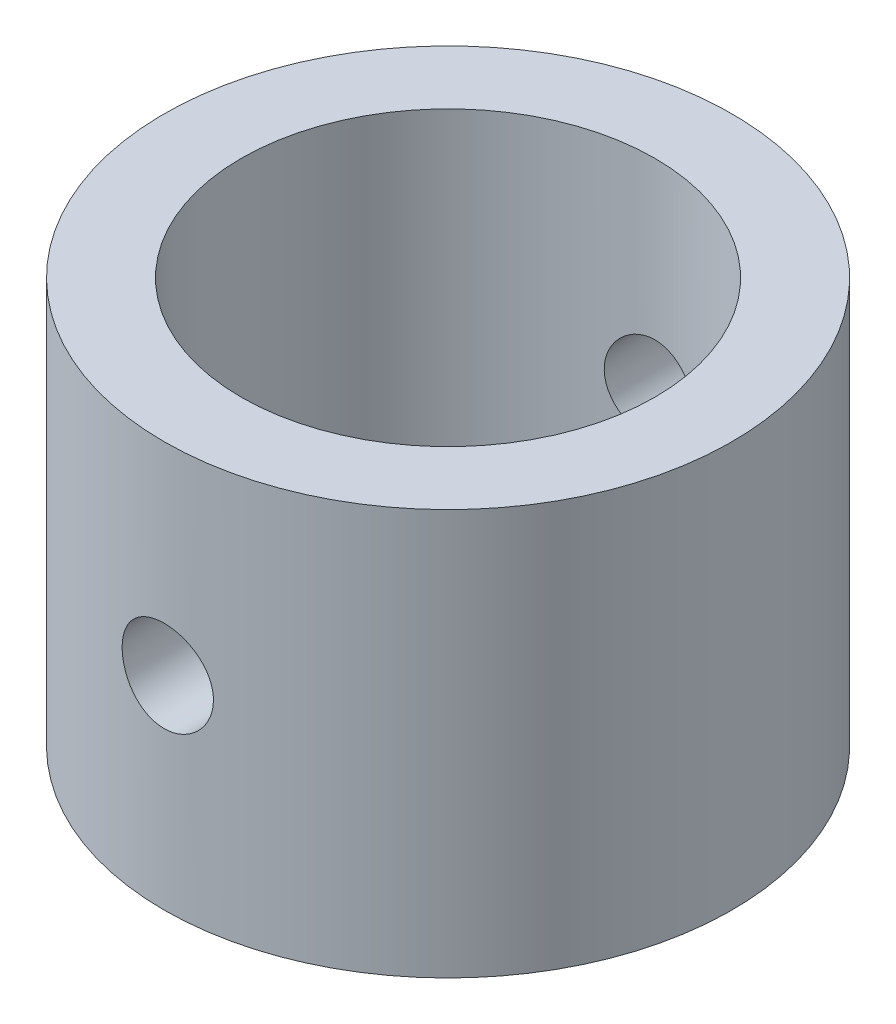
ISO-10303-21;
HEADER;
FILE_DESCRIPTION(('STEP AP214'),'2;1');
FILE_NAME('part.step','',(''),(''),'','','');
FILE_SCHEMA(('AUTOMOTIVE_DESIGN { 1 0 10303 214 1 1 1 1 }'));
ENDSEC;
DATA;
#1=APPLICATION_CONTEXT('core data for automotive mechanical design processes');
#2=APPLICATION_PROTOCOL_DEFINITION('international standard','automotive_design',2000,#1);
#3=PRODUCT_CONTEXT('',#1,'mechanical');
#4=PRODUCT('Part','Part','',(#3));
#5=PRODUCT_RELATED_PRODUCT_CATEGORY('part','',(#4));
#6=PRODUCT_DEFINITION_FORMATION('','',#4);
#7=PRODUCT_DEFINITION_CONTEXT('part definition',#1,'design');
#8=PRODUCT_DEFINITION('design','',#6,#7);
#9=PRODUCT_DEFINITION_SHAPE('','',#8);
#10=(LENGTH_UNIT() NAMED_UNIT(*) SI_UNIT(.MILLI.,.METRE.));
#11=(NAMED_UNIT(*) PLANE_ANGLE_UNIT() SI_UNIT($,.RADIAN.));
#12=(NAMED_UNIT(*) SI_UNIT($,.STERADIAN.) SOLID_ANGLE_UNIT());
#13=UNCERTAINTY_MEASURE_WITH_UNIT(LENGTH_MEASURE(1.E-05),#10,'distance_accuracy_value','');
#14=(GEOMETRIC_REPRESENTATION_CONTEXT(3) GLOBAL_UNCERTAINTY_ASSIGNED_CONTEXT((#13)) GLOBAL_UNIT_ASSIGNED_CONTEXT((#10,
#11,#12)) REPRESENTATION_CONTEXT('',''));
#15=CARTESIAN_POINT('',(0.,0.,0.));
#16=DIRECTION('',(0.,0.,1.));
#17=DIRECTION('',(1.,0.,0.));
#18=AXIS2_PLACEMENT_3D('',#15,#16,#17);
#19=CARTESIAN_POINT('',(0.,10.,0.));
#20=DIRECTION('',(0.,1.,0.));
#21=DIRECTION('',(0.,0.,1.));
#22=AXIS2_PLACEMENT_3D('',#19,#20,#21);
#23=PLANE('',#22);
#24=CARTESIAN_POINT('',(0.,10.,0.));
#25=DIRECTION('',(0.,1.,0.));
#26=DIRECTION('',(0.,0.,1.));
#27=AXIS2_PLACEMENT_3D('',#24,#25,#26);
#28=CIRCLE('',#27,14.);
#29=CARTESIAN_POINT('',(0.,10.,14.));
#30=VERTEX_POINT('',#29);
#31=EDGE_CURVE('E10',#30,#30,#28,.T.);
#32=ORIENTED_EDGE('',*,*,#31,.T.);
#33=EDGE_LOOP('',(#32));
#34=FACE_BOUND('',#33,.T.);
#35=CARTESIAN_POINT('',(0.,10.,0.));
#36=DIRECTION('',(0.,1.,0.));
#37=DIRECTION('',(0.,0.,1.));
#38=AXIS2_PLACEMENT_3D('',#35,#36,#37);
#39=CIRCLE('',#38,10.2);
#40=CARTESIAN_POINT('',(0.,10.,10.2));
#41=VERTEX_POINT('',#40);
#42=EDGE_CURVE('E58',#41,#41,#39,.T.);
#43=ORIENTED_EDGE('',*,*,#42,.F.);
#44=EDGE_LOOP('',(#43));
#45=FACE_BOUND('',#44,.T.);
#46=ADVANCED_FACE('F37',(#34,#45),#23,.T.);
#47=CARTESIAN_POINT('',(0.,-10.,0.));
#48=DIRECTION('',(0.,1.,0.));
#49=DIRECTION('',(0.,0.,1.));
#50=AXIS2_PLACEMENT_3D('',#47,#48,#49);
#51=PLANE('',#50);
#52=CARTESIAN_POINT('',(0.,-10.,0.));
#53=DIRECTION('',(0.,1.,0.));
#54=DIRECTION('',(0.,0.,1.));
#55=AXIS2_PLACEMENT_3D('',#52,#53,#54);
#56=CIRCLE('',#55,14.);
#57=CARTESIAN_POINT('',(0.,-10.,14.));
#58=VERTEX_POINT('',#57);
#59=EDGE_CURVE('E52',#58,#58,#56,.T.);
#60=ORIENTED_EDGE('',*,*,#59,.F.);
#61=EDGE_LOOP('',(#60));
#62=FACE_BOUND('',#61,.T.);
#63=CARTESIAN_POINT('',(0.,-10.,0.));
#64=DIRECTION('',(0.,1.,0.));
#65=DIRECTION('',(0.,0.,1.));
#66=AXIS2_PLACEMENT_3D('',#63,#64,#65);
#67=CIRCLE('',#66,10.2);
#68=CARTESIAN_POINT('',(0.,-10.,10.2));
#69=VERTEX_POINT('',#68);
#70=EDGE_CURVE('E61',#69,#69,#67,.T.);
#71=ORIENTED_EDGE('',*,*,#70,.T.);
#72=EDGE_LOOP('',(#71));
#73=FACE_BOUND('',#72,.T.);
#74=ADVANCED_FACE('F102',(#62,#73),#51,.F.);
#75=CARTESIAN_POINT('',(0.,10.,0.));
#76=DIRECTION('',(0.,-1.,0.));
#77=DIRECTION('',(0.,0.,-1.));
#78=AXIS2_PLACEMENT_3D('',#75,#76,#77);
#79=CYLINDRICAL_SURFACE('',#78,14.);
#80=CARTESIAN_POINT('',(0.,2.25,-14.));
#81=CARTESIAN_POINT('',(-0.125516533296971,2.24999491192685,-13.9999978953155));
#82=CARTESIAN_POINT('',(-0.251103168327577,2.23946159453523,-13.9982944063614));
#83=CARTESIAN_POINT('',(-0.498758541647425,2.19762162062177,-13.9916628549738));
#84=CARTESIAN_POINT('',(-0.620823862200513,2.1662954467732,-13.9867317629939));
#85=CARTESIAN_POINT('',(-0.857817334758492,2.08383634265778,-13.9741984828469));
#86=CARTESIAN_POINT('',(-0.972751077913987,2.03271916211685,-13.9665984190993));
#87=CARTESIAN_POINT('',(-1.19239438325836,1.9121693193533,-13.9495643746679));
#88=CARTESIAN_POINT('',(-1.2971052045874,1.84273891664883,-13.9401306202659));
#89=CARTESIAN_POINT('',(-1.49427970681561,1.68687455477166,-13.9203821378141));
#90=CARTESIAN_POINT('',(-1.5866390108593,1.60030935524402,-13.9100609815654));
#91=CARTESIAN_POINT('',(-1.75558751079347,1.41291514321349,-13.8897505626212));
#92=CARTESIAN_POINT('',(-1.83217574468168,1.31208526122732,-13.879761320203));
#93=CARTESIAN_POINT('',(-1.96782198120126,1.0983125852725,-13.8611834660328));
#94=CARTESIAN_POINT('',(-2.02677758177242,0.985304028797502,-13.8526031617175));
#95=CARTESIAN_POINT('',(-2.12483033718463,0.750827212664779,-13.8379033650299));
#96=CARTESIAN_POINT('',(-2.1639287371439,0.629359483970944,-13.8317837183705));
#97=CARTESIAN_POINT('',(-2.22083007809586,0.382515668063071,-13.8227618401327));
#98=CARTESIAN_POINT('',(-2.2388126801822,0.257182005550972,-13.8198324801479));
#99=CARTESIAN_POINT('',(-2.25352883443453,0.0052445866959005,-13.8174406805388));
#100=CARTESIAN_POINT('',(-2.25026378530402,-0.121359085496286,-13.817978012707));
#101=CARTESIAN_POINT('',(-2.22272383675772,-0.370965144860001,-13.8224341022552));
#102=CARTESIAN_POINT('',(-2.19865012172645,-0.49399039133296,-13.8263204789813));
#103=CARTESIAN_POINT('',(-2.13049164056933,-0.734232553432275,-13.8369861134628));
#104=CARTESIAN_POINT('',(-2.08640623221295,-0.851449282513342,-13.8437654640614));
#105=CARTESIAN_POINT('',(-1.97926987660231,-1.07735296235875,-13.8594884549807));
#106=CARTESIAN_POINT('',(-1.91613477101002,-1.18599930712865,-13.8684416640377));
#107=CARTESIAN_POINT('',(-1.7727510132204,-1.39123208940431,-13.8874968298953));
#108=CARTESIAN_POINT('',(-1.69250107470795,-1.48781761957885,-13.8975988730133));
#109=CARTESIAN_POINT('',(-1.51606648187991,-1.66735215012952,-13.9179560350544));
#110=CARTESIAN_POINT('',(-1.41970908051139,-1.75013143216778,-13.9282115777295));
#111=CARTESIAN_POINT('',(-1.2143806998317,-1.89837114136773,-13.9476125542075));
#112=CARTESIAN_POINT('',(-1.10540964947444,-1.96383147097402,-13.9567579817571));
#113=CARTESIAN_POINT('',(-0.877792282352266,-2.07558805464745,-13.9729199627032));
#114=CARTESIAN_POINT('',(-0.75913882854674,-2.12187001650982,-13.9799349273889));
#115=CARTESIAN_POINT('',(-0.51560535892936,-2.19380226680228,-13.991032650818));
#116=CARTESIAN_POINT('',(-0.390725827843726,-2.21945415871432,-13.9951156374482));
#117=CARTESIAN_POINT('',(-0.139748614277979,-2.24916965405059,-13.9998588902675));
#118=CARTESIAN_POINT('',(-0.01367920571617,-2.25346637021372,-14.0005561134573));
#119=CARTESIAN_POINT('',(0.237378752507188,-2.24097002524617,-13.9985502742979));
#120=CARTESIAN_POINT('',(0.362367340584751,-2.22417771681883,-13.9958473333064));
#121=CARTESIAN_POINT('',(0.607000788097725,-2.17017387383038,-13.9873677389695));
#122=CARTESIAN_POINT('',(0.726671625613749,-2.13307707167091,-13.9816083618081));
#123=CARTESIAN_POINT('',(0.958095333397108,-2.03963910536011,-13.9676592546813));
#124=CARTESIAN_POINT('',(1.06984778490242,-1.98329692433714,-13.9594693962991));
#125=CARTESIAN_POINT('',(1.28327965745295,-1.85242886164486,-13.9414766855724));
#126=CARTESIAN_POINT('',(1.38486818456638,-1.77775653102941,-13.9316610604782));
#127=CARTESIAN_POINT('',(1.57415535691987,-1.61255019273464,-13.9115460049717));
#128=CARTESIAN_POINT('',(1.66185306743064,-1.52201511849538,-13.9012465420618));
#129=CARTESIAN_POINT('',(1.82172745317086,-1.32661054590671,-13.8812059717835));
#130=CARTESIAN_POINT('',(1.8937470747044,-1.22161180310217,-13.871471172488));
#131=CARTESIAN_POINT('',(2.01912597155802,-1.00086981075429,-13.8537776909451));
#132=CARTESIAN_POINT('',(2.07248580747758,-0.885126884132718,-13.8458189553416));
#133=CARTESIAN_POINT('',(2.15879239469767,-0.646631920879235,-13.8326254500163));
#134=CARTESIAN_POINT('',(2.19181896632761,-0.52390938451031,-13.8273800419845));
#135=CARTESIAN_POINT('',(2.23677380807863,-0.274567940734186,-13.8201798155706));
#136=CARTESIAN_POINT('',(2.24870377188689,-0.147949346942423,-13.8182247330338));
#137=CARTESIAN_POINT('',(2.25108206443364,0.10402279363205,-13.8178373502801));
#138=CARTESIAN_POINT('',(2.24177749627082,0.229374014843842,-13.8193645273463));
#139=CARTESIAN_POINT('',(2.20248339939032,0.476703241059103,-13.8256810526982));
#140=CARTESIAN_POINT('',(2.17249392454782,0.598681254847449,-13.8304703924874));
#141=CARTESIAN_POINT('',(2.09277331754399,0.83571595850409,-13.8427566578776));
#142=CARTESIAN_POINT('',(2.04306199075129,0.950779459089346,-13.8502508664761));
#143=CARTESIAN_POINT('',(1.92533386106839,1.17097320402977,-13.8671053274846));
#144=CARTESIAN_POINT('',(1.85731625543178,1.2761030125106,-13.8764656617212));
#145=CARTESIAN_POINT('',(1.70401854872738,1.47469620036646,-13.8961268489787));
#146=CARTESIAN_POINT('',(1.61855618855353,1.56801799448917,-13.9064369431357));
#147=CARTESIAN_POINT('',(1.43317978986591,1.73908156829962,-13.9267609958316));
#148=CARTESIAN_POINT('',(1.33326241319938,1.81681973928121,-13.9367748853215));
#149=CARTESIAN_POINT('',(1.12105724158449,1.95495911574053,-13.9554519057441));
#150=CARTESIAN_POINT('',(1.00869460504507,2.01524657121163,-13.9641060131734));
#151=CARTESIAN_POINT('',(0.775346742328359,2.11599979291454,-13.9790004101793));
#152=CARTESIAN_POINT('',(0.654370373204388,2.15648559238242,-13.9852431379863));
#153=CARTESIAN_POINT('',(0.444080359846441,2.20755159889226,-13.9932258515082));
#154=CARTESIAN_POINT('',(0.356048797339001,2.22344469007745,-13.9957527763908));
#155=CARTESIAN_POINT('',(0.178689987837779,2.24467062083802,-13.9991405870761));
#156=CARTESIAN_POINT('',(0.0893627607529358,2.25000362250495,-14.0000014984513));
#157=CARTESIAN_POINT('',(0.,2.25,-14.));
#158=B_SPLINE_CURVE_WITH_KNOTS('',3,(#80,#81,#82,#83,#84,#85,#86,#87,#88,#89,#90,#91,#92,#93,
#94,#95,#96,#97,#98,#99,#100,#101,#102,#103,#104,#105,#106,#107,#108,#109,#110,#111,#112,#113,
#114,#115,#116,#117,#118,#119,#120,#121,#122,#123,#124,#125,#126,#127,#128,#129,#130,#131,#132,
#133,#134,#135,#136,#137,#138,#139,#140,#141,#142,#143,#144,#145,#146,#147,#148,#149,#150,#151,
#152,#153,#154,#155,#156,#157),.UNSPECIFIED.,.T.,.F.,(4,2,2,2,2,2,2,2,2,2,2,2,2,2,2,2,2,2,2,2,2,
2,2,2,2,2,2,2,2,2,2,2,2,2,2,2,2,2,4),(0.,0.3762229925383,0.752799629164132,1.12907719922893,
1.505308365192,1.88454122461197,2.26379720959484,2.64521477626392,3.02660842372012,
3.40473296198993,3.78283260909597,4.15731705278776,4.5318135155697,4.9079892861148,
5.28419333921513,5.66472669966152,6.04526220355716,6.42608078433829,6.80686976295353,
7.18349278385415,7.56010236281749,7.93460552093183,8.30912846980019,8.68674705506086,
9.06439103993249,9.44565973837655,9.82691698130851,10.2066678539783,10.5863882379366,
10.9617124352364,11.3370356549837,11.7119829123441,12.0869466141509,12.4660492312635,
12.8452395361732,13.2268485762512,13.6080707416578,13.8759306040537,14.1437863549165),.UNSPECIFIED.);
#159=CARTESIAN_POINT('',(0.,2.25,-14.));
#160=VERTEX_POINT('',#159);
#161=EDGE_CURVE('E88',#160,#160,#158,.T.);
#162=ORIENTED_EDGE('',*,*,#161,.T.);
#163=EDGE_LOOP('',(#162));
#164=FACE_BOUND('',#163,.T.);
#165=CARTESIAN_POINT('',(2.25,0.,13.8180136054355));
#166=CARTESIAN_POINT('',(2.2499949019903,-0.125504732771006,13.8180158143356));
#167=CARTESIAN_POINT('',(2.23946349824246,-0.251079597561315,13.8197420063408));
#168=CARTESIAN_POINT('',(2.19763181494983,-0.498710522553538,13.8264545702036));
#169=CARTESIAN_POINT('',(2.1663119749452,-0.620763155611108,13.8314440124859));
#170=CARTESIAN_POINT('',(2.08387139310641,-0.857729778170382,13.8441037030698));
#171=CARTESIAN_POINT('',(2.03276670010773,-0.972649466242985,13.8517717780596));
#172=CARTESIAN_POINT('',(1.91224628050508,-1.19226914240462,13.8689221632735));
#173=CARTESIAN_POINT('',(1.84283278367579,-1.29697037284334,13.8784042525357));
#174=CARTESIAN_POINT('',(1.68698563634041,-1.49415537839284,13.8982114889076));
#175=CARTESIAN_POINT('',(1.60041695690168,-1.58653181527783,13.9085429171883));
#176=CARTESIAN_POINT('',(1.41300854829686,-1.75551347537041,13.9288288469069));
#177=CARTESIAN_POINT('',(1.3121679968303,-1.83211778921304,13.9387833265841));
#178=CARTESIAN_POINT('',(1.09838564892168,-1.96778110258191,13.9572599640666));
#179=CARTESIAN_POINT('',(0.985379925683778,-2.02674058201544,13.9657738839782));
#180=CARTESIAN_POINT('',(0.750909255437473,-2.12480128575263,13.9803403340124));
#181=CARTESIAN_POINT('',(0.629444820813649,-2.16390371170516,13.9863930130725));
#182=CARTESIAN_POINT('',(0.382612416075231,-2.22081308024024,13.9953106771013));
#183=CARTESIAN_POINT('',(0.257286968989389,-2.23880016566319,13.9982026126886));
#184=CARTESIAN_POINT('',(0.0053657339776195,-2.25352813465873,14.0005654594673));
#185=CARTESIAN_POINT('',(-0.121229972889171,-2.25027036542877,14.000036587582));
#186=CARTESIAN_POINT('',(-0.37086743101994,-2.22274220536869,13.9956388165465));
#187=CARTESIAN_POINT('',(-0.493931178306543,-2.19866565952152,13.9918007306488));
#188=CARTESIAN_POINT('',(-0.734248869659234,-2.13048827281503,13.9812501178409));
#189=CARTESIAN_POINT('',(-0.851502646539959,-2.08638685609882,13.9745375082682));
#190=CARTESIAN_POINT('',(-1.07745224991504,-1.97921682625188,13.9589394210759));
#191=CARTESIAN_POINT('',(-1.18610922857626,-1.91606770160813,13.9500447506393));
#192=CARTESIAN_POINT('',(-1.39135738695854,-1.77265373625922,13.9310719029915));
#193=CARTESIAN_POINT('',(-1.4879476562894,-1.69238760537217,13.9209936365935));
#194=CARTESIAN_POINT('',(-1.66746488622605,-1.51594118870135,13.9006413457914));
#195=CARTESIAN_POINT('',(-1.75022536650925,-1.419591543466,13.8903663957158));
#196=CARTESIAN_POINT('',(-1.89843078838734,-1.21428549681817,13.8708891283976));
#197=CARTESIAN_POINT('',(-1.96387559119058,-1.10532899436706,13.861686819753));
#198=CARTESIAN_POINT('',(-2.07562085663178,-0.877716254800834,13.8453965432241));
#199=CARTESIAN_POINT('',(-2.12190235831856,-0.759050549336767,13.8383106713505));
#200=CARTESIAN_POINT('',(-2.19382996628623,-0.515490349518272,13.8270910884814));
#201=CARTESIAN_POINT('',(-2.21947775464433,-0.390596363780057,13.822957136846));
#202=CARTESIAN_POINT('',(-2.24917771973425,-0.139611357135541,13.8181556881829));
#203=CARTESIAN_POINT('',(-2.25346672746734,-0.0135490643513698,13.8174501779496));
#204=CARTESIAN_POINT('',(-2.24095750557602,0.23749283743298,13.8194843635913));
#205=CARTESIAN_POINT('',(-2.22416003099588,0.362472485038121,13.8222239361082));
#206=CARTESIAN_POINT('',(-2.17015619952393,0.607055945852306,13.8308045601376));
#207=CARTESIAN_POINT('',(-2.13306944727635,0.726686861750487,13.8366274293191));
#208=CARTESIAN_POINT('',(-2.03966487822762,0.958035147666284,13.850703396658));
#209=CARTESIAN_POINT('',(-1.98334598412219,1.06975207395187,13.8589566309507));
#210=CARTESIAN_POINT('',(-1.85251316029193,1.2831579914825,13.8770521782456));
#211=CARTESIAN_POINT('',(-1.7778468945306,1.38475246320142,13.886907548938));
#212=CARTESIAN_POINT('',(-1.61264890126915,1.57405443467415,13.9070583117423));
#213=CARTESIAN_POINT('',(-1.52211613899784,1.66176102798646,13.9173537325201));
#214=CARTESIAN_POINT('',(-1.32670807927494,1.82165712109073,13.9373442751628));
#215=CARTESIAN_POINT('',(-1.22170304760801,1.8936890421619,13.9470326606656));
#216=CARTESIAN_POINT('',(-1.00094495604244,2.01908949130633,13.9646107137023));
#217=CARTESIAN_POINT('',(-0.885192224745501,2.07245858974172,13.9725004362034));
#218=CARTESIAN_POINT('',(-0.64670142804812,2.1587707969855,13.9855628405076));
#219=CARTESIAN_POINT('',(-0.523994333659257,2.19179772513674,13.9907466582525));
#220=CARTESIAN_POINT('',(-0.274685660668645,2.23675850314725,13.9978601357504));
#221=CARTESIAN_POINT('',(-0.148084379853011,2.24869396179906,13.9997900437012));
#222=CARTESIAN_POINT('',(0.103895289129518,2.25108929111569,14.0001751220149));
#223=CARTESIAN_POINT('',(0.229271399482689,2.24178941298781,13.9986691650403));
#224=CARTESIAN_POINT('',(0.47665162878274,2.20249598268264,13.9924307182936));
#225=CARTESIAN_POINT('',(0.598655763466231,2.17250252709682,13.9876982435818));
#226=CARTESIAN_POINT('',(0.835746505612654,2.09276301465596,13.9755363711605));
#227=CARTESIAN_POINT('',(0.950839657845103,2.04303599650222,13.9681095734919));
#228=CARTESIAN_POINT('',(1.17108623058329,1.92526723336825,13.9513716274726));
#229=CARTESIAN_POINT('',(1.27623923359936,1.85722471959233,13.9420604000267));
#230=CARTESIAN_POINT('',(1.47483400791959,1.70389838988066,13.9224618007875));
#231=CARTESIAN_POINT('',(1.56813860795188,1.61843808333874,13.9121650601924));
#232=CARTESIAN_POINT('',(1.73916844442504,1.43307302781877,13.8918224249021));
#233=CARTESIAN_POINT('',(1.81689002569547,1.33316489938053,13.8817765895422));
#234=CARTESIAN_POINT('',(1.95501006976206,1.12096843045257,13.8630025603077));
#235=CARTESIAN_POINT('',(2.01529216853239,1.00860354966341,13.8542833934605));
#236=CARTESIAN_POINT('',(2.11603476746344,0.775251208551566,13.8392562448519));
#237=CARTESIAN_POINT('',(2.15651535402701,0.654272629200527,13.8329458211258));
#238=CARTESIAN_POINT('',(2.20756776728415,0.44399629895971,13.8248718092132));
#239=CARTESIAN_POINT('',(2.22345476618064,0.355981561552269,13.8223140356461));
#240=CARTESIAN_POINT('',(2.24467261207563,0.178656382936134,13.8188841610933));
#241=CARTESIAN_POINT('',(2.25000362923831,0.0893459626374435,13.8180120329346));
#242=CARTESIAN_POINT('',(2.25,0.,13.8180136054355));
#243=B_SPLINE_CURVE_WITH_KNOTS('',3,(#165,#166,#167,#168,#169,#170,#171,#172,#173,#174,#175,
#176,#177,#178,#179,#180,#181,#182,#183,#184,#185,#186,#187,#188,#189,#190,#191,#192,#193,#194,
#195,#196,#197,#198,#199,#200,#201,#202,#203,#204,#205,#206,#207,#208,#209,#210,#211,#212,#213,
#214,#215,#216,#217,#218,#219,#220,#221,#222,#223,#224,#225,#226,#227,#228,#229,#230,#231,#232,
#233,#234,#235,#236,#237,#238,#239,#240,#241,#242),.UNSPECIFIED.,.T.,.F.,(4,2,2,2,2,2,2,2,2,2,2,
2,2,2,2,2,2,2,2,2,2,2,2,2,2,2,2,2,2,2,2,2,2,2,2,2,2,2,4),(0.,0.376187533649366,
0.752729536107984,1.12896673764322,1.50515813950989,1.8844374148329,2.26373855194078,
2.64514035629039,3.0265190773722,3.40461990725563,3.78269676090913,4.15729076600476,
4.53189554401378,4.90810644725458,5.28434571714748,5.66483058584771,6.04531850418464,
6.42618199831163,6.80701444098739,7.18361457608907,7.5602012266437,7.93459146442295,
8.30900267742112,8.68663435013169,9.06429066015825,9.44558414005216,9.82686596606156,
10.2065660327795,10.5862371358917,10.9616340490979,11.3370292100753,11.712063071469,
12.087112677421,12.4661705354271,12.8453172019205,13.2269382476957,13.6081713749863,
13.8759810297257,14.1437863672936),.UNSPECIFIED.);
#244=CARTESIAN_POINT('',(2.25,0.,13.8180136054355));
#245=VERTEX_POINT('',#244);
#246=EDGE_CURVE('E82',#245,#245,#243,.T.);
#247=ORIENTED_EDGE('',*,*,#246,.T.);
#248=EDGE_LOOP('',(#247));
#249=FACE_BOUND('',#248,.T.);
#250=ORIENTED_EDGE('',*,*,#31,.F.);
#251=EDGE_LOOP('',(#250));
#252=FACE_BOUND('',#251,.T.);
#253=ORIENTED_EDGE('',*,*,#59,.T.);
#254=EDGE_LOOP('',(#253));
#255=FACE_BOUND('',#254,.T.);
#256=ADVANCED_FACE('F39',(#164,#249,#252,#255),#79,.T.);
#257=CARTESIAN_POINT('',(0.,10.,0.));
#258=DIRECTION('',(0.,-1.,0.));
#259=DIRECTION('',(0.,0.,-1.));
#260=AXIS2_PLACEMENT_3D('',#257,#258,#259);
#261=CYLINDRICAL_SURFACE('',#260,10.2);
#262=CARTESIAN_POINT('',(0.,2.25,-10.2));
#263=CARTESIAN_POINT('',(-0.124764174505006,2.24999577656357,-10.1999977027666));
#264=CARTESIAN_POINT('',(-0.249579153208695,2.23958757126949,-10.1976876313943));
#265=CARTESIAN_POINT('',(-0.495661985850825,2.19827403882562,-10.1886954635131));
#266=CARTESIAN_POINT('',(-0.616927271339807,2.16735423507471,-10.1820102791978));
#267=CARTESIAN_POINT('',(-0.852318898678437,2.086034497785,-10.1650120015536));
#268=CARTESIAN_POINT('',(-0.966452614575012,2.03565508611887,-10.1547027311693));
#269=CARTESIAN_POINT('',(-1.18464370312069,1.91691175478381,-10.1315681097671));
#270=CARTESIAN_POINT('',(-1.28870130187285,1.8485482387972,-10.1187428152272));
#271=CARTESIAN_POINT('',(-1.48548669232062,1.6945978533885,-10.091746625768));
#272=CARTESIAN_POINT('',(-1.57802668841411,1.60877388398141,-10.0775588054433));
#273=CARTESIAN_POINT('',(-1.74752142602877,1.4228477511948,-10.0495554871774));
#274=CARTESIAN_POINT('',(-1.82447475890951,1.32274429870294,-10.0357400229855));
#275=CARTESIAN_POINT('',(-1.96144336336071,1.10970835306626,-10.0098785747494));
#276=CARTESIAN_POINT('',(-2.0212581443349,0.996644090401658,-9.99785426794003));
#277=CARTESIAN_POINT('',(-2.12096549481324,0.761759539182453,-9.97717973314191));
#278=CARTESIAN_POINT('',(-2.16086049019061,0.639940318892932,-9.96852909432888));
#279=CARTESIAN_POINT('',(-2.21897402474801,0.39304260430619,-9.9557538178659));
#280=CARTESIAN_POINT('',(-2.23752535760456,0.268046109803409,-9.95155977373163));
#281=CARTESIAN_POINT('',(-2.25345984807385,0.0166500148252579,-9.94796413881408));
#282=CARTESIAN_POINT('',(-2.25084565369365,-0.109749408154606,-9.9485619485246));
#283=CARTESIAN_POINT('',(-2.22479098131645,-0.357885076634104,-9.95441966531722));
#284=CARTESIAN_POINT('',(-2.20173765027849,-0.47966432981722,-9.9595929027298));
#285=CARTESIAN_POINT('',(-2.13607269880298,-0.717583086430618,-9.97388149095551));
#286=CARTESIAN_POINT('',(-2.09345996425897,-0.833722268184858,-9.98299706632309));
#287=CARTESIAN_POINT('',(-1.98953179202404,-1.05814964595546,-10.0042283104756));
#288=CARTESIAN_POINT('',(-1.9280679633098,-1.16636679388057,-10.0163676336361));
#289=CARTESIAN_POINT('',(-1.78828664178137,-1.3710942305395,-10.0422641355573));
#290=CARTESIAN_POINT('',(-1.70996681445608,-1.46760289478136,-10.056021538298));
#291=CARTESIAN_POINT('',(-1.53664981310273,-1.64840220719729,-10.0839755658964));
#292=CARTESIAN_POINT('',(-1.44132356993324,-1.73237725634981,-10.0981751941245));
#293=CARTESIAN_POINT('',(-1.23777995455844,-1.88320074793411,-10.1251381918741));
#294=CARTESIAN_POINT('',(-1.12956234108643,-1.95004886975543,-10.1379015345065));
#295=CARTESIAN_POINT('',(-0.902919035635492,-2.06480100498394,-10.1605964257697));
#296=CARTESIAN_POINT('',(-0.784471456765543,-2.11266311092598,-10.1705216966576));
#297=CARTESIAN_POINT('',(-0.540947212530485,-2.18771656449219,-10.1863755462739));
#298=CARTESIAN_POINT('',(-0.415871530929465,-2.21491097054111,-10.1923047163342));
#299=CARTESIAN_POINT('',(-0.165348136015659,-2.24739675854658,-10.1994139510997));
#300=CARTESIAN_POINT('',(-0.0399588926663982,-2.25311917460944,-10.2006874610742));
#301=CARTESIAN_POINT('',(0.209983939541013,-2.24366762083829,-10.1986039845559));
#302=CARTESIAN_POINT('',(0.334537585501884,-2.22849509383726,-10.1952473177851));
#303=CARTESIAN_POINT('',(0.57784154466608,-2.17804166285798,-10.1843396728686));
#304=CARTESIAN_POINT('',(0.696641153218765,-2.14298734743218,-10.17683598172));
#305=CARTESIAN_POINT('',(0.926673931622172,-2.05401731493757,-10.1584743955523));
#306=CARTESIAN_POINT('',(1.03790644833292,-2.00009997220127,-10.1476162114432));
#307=CARTESIAN_POINT('',(1.25142613768722,-1.87403986835163,-10.1235198955913));
#308=CARTESIAN_POINT('',(1.35356048954898,-1.80164454909581,-10.1102495839341));
#309=CARTESIAN_POINT('',(1.54438559075579,-1.64101554401239,-10.0828657904622));
#310=CARTESIAN_POINT('',(1.63307455930169,-1.55277976353948,-10.0687521973021));
#311=CARTESIAN_POINT('',(1.79619959237253,-1.3609951347569,-10.0409489876431));
#312=CARTESIAN_POINT('',(1.87033694324694,-1.25718998746651,-10.0272722983527));
#313=CARTESIAN_POINT('',(2.00012805974088,-1.03834930883795,-10.0021935125848));
#314=CARTESIAN_POINT('',(2.05578262946161,-0.923314266342936,-9.99079131716326));
#315=CARTESIAN_POINT('',(2.14664942055242,-0.685898407519863,-9.97166255922927));
#316=CARTESIAN_POINT('',(2.1819772751943,-0.563563602029404,-9.96391525136957));
#317=CARTESIAN_POINT('',(2.23152506529072,-0.314500799037427,-9.95293683785859));
#318=CARTESIAN_POINT('',(2.24574844264431,-0.187773521348659,-9.94970499579147));
#319=CARTESIAN_POINT('',(2.25253510422282,0.0634636103722608,-9.94817040033812));
#320=CARTESIAN_POINT('',(2.24557220291493,0.187960239761186,-9.94975982073482));
#321=CARTESIAN_POINT('',(2.21124461801134,0.433959228281788,-9.95744450003778));
#322=CARTESIAN_POINT('',(2.18388018339176,0.555461623935785,-9.96353970395638));
#323=CARTESIAN_POINT('',(2.10975698328272,0.791638986582999,-9.97949617321249));
#324=CARTESIAN_POINT('',(2.063068295671,0.906336928368381,-9.98934382047356));
#325=CARTESIAN_POINT('',(1.95168169697153,1.12634172244347,-10.0117007150081));
#326=CARTESIAN_POINT('',(1.88698187279526,1.23164757556416,-10.0242102449854));
#327=CARTESIAN_POINT('',(1.73984289144315,1.43221212680876,-10.0508026767051));
#328=CARTESIAN_POINT('',(1.65706654912887,1.52721991858059,-10.0649126259551));
#329=CARTESIAN_POINT('',(1.47680613231873,1.70215184962184,-10.0929355233117));
#330=CARTESIAN_POINT('',(1.37931865903553,1.78207249360101,-10.1068484250788));
#331=CARTESIAN_POINT('',(1.17084712832558,1.92557598724589,-10.1331282559513));
#332=CARTESIAN_POINT('',(1.0597014210588,1.98892843957059,-10.145472269695));
#333=CARTESIAN_POINT('',(0.828089284477382,2.09595176542446,-10.1669930248578));
#334=CARTESIAN_POINT('',(0.707630707859561,2.1396390132513,-10.1761723998273));
#335=CARTESIAN_POINT('',(0.489224208034148,2.19837756476082,-10.1887072558327));
#336=CARTESIAN_POINT('',(0.39245077587407,2.21769877776524,-10.1929156488516));
#337=CARTESIAN_POINT('',(0.197128747362554,2.24351137037539,-10.1985628651269));
#338=CARTESIAN_POINT('',(0.0985802324509254,2.25000333707449,-10.2000018151188));
#339=CARTESIAN_POINT('',(0.,2.25,-10.2));
#340=B_SPLINE_CURVE_WITH_KNOTS('',3,(#262,#263,#264,#265,#266,#267,#268,#269,#270,#271,#272,
#273,#274,#275,#276,#277,#278,#279,#280,#281,#282,#283,#284,#285,#286,#287,#288,#289,#290,#291,
#292,#293,#294,#295,#296,#297,#298,#299,#300,#301,#302,#303,#304,#305,#306,#307,#308,#309,#310,
#311,#312,#313,#314,#315,#316,#317,#318,#319,#320,#321,#322,#323,#324,#325,#326,#327,#328,#329,
#330,#331,#332,#333,#334,#335,#336,#337,#338,#339),.UNSPECIFIED.,.T.,.F.,(4,2,2,2,2,2,2,2,2,2,2,
2,2,2,2,2,2,2,2,2,2,2,2,2,2,2,2,2,2,2,2,2,2,2,2,2,2,2,4),(0.,0.373931657494397,
0.748127508288031,1.12192980925239,1.49572372033468,1.87498021206442,2.25427096371775,
2.63783275873624,3.02134783139575,3.39879838665644,3.77620172002283,4.146605667313,
4.51703071548452,4.89044993342212,5.26392090225035,5.64561032997554,6.02730690228011,
6.40984135949883,6.79231919789763,7.16707669361207,7.54180831295246,7.91235262376947,
8.28292887698219,8.65887016158694,9.03486119502434,9.41790830506423,9.80093874829396,
10.1817681233911,10.5625353827405,10.9348501476368,11.3071603689547,11.6781321046278,
12.0491432588424,12.4277778248663,12.8065000030687,13.190238003032,13.5736558885409,
13.8691249755151,14.1645805408872),.UNSPECIFIED.);
#341=CARTESIAN_POINT('',(0.,2.25,-10.2));
#342=VERTEX_POINT('',#341);
#343=EDGE_CURVE('E42',#342,#342,#340,.T.);
#344=ORIENTED_EDGE('',*,*,#343,.F.);
#345=EDGE_LOOP('',(#344));
#346=FACE_BOUND('',#345,.T.);
#347=CARTESIAN_POINT('',(2.25,0.,9.94874363927426));
#348=CARTESIAN_POINT('',(2.24999574701754,-0.124722541468415,9.9487461597406));
#349=CARTESIAN_POINT('',(2.23959425082939,-0.249495959767615,9.95111456683165));
#350=CARTESIAN_POINT('',(2.19830977969411,-0.495492524904388,9.96031450775669));
#351=CARTESIAN_POINT('',(2.16741216055189,-0.616713068553135,9.96714923266065));
#352=CARTESIAN_POINT('',(2.08615726955793,-0.852009888896141,9.98447093040954));
#353=CARTESIAN_POINT('',(2.03582155878754,-0.96609391918887,9.99495385533678));
#354=CARTESIAN_POINT('',(1.9171812739928,-1.18420108473021,10.018385911099));
#355=CARTESIAN_POINT('',(1.84887700530674,-1.28822439089883,10.0313350000257));
#356=CARTESIAN_POINT('',(1.69498764932738,-1.48504568840388,10.0584888975556));
#357=CARTESIAN_POINT('',(1.60915214152164,-1.57764566898595,10.0727100011707));
#358=CARTESIAN_POINT('',(1.42317738812128,-1.74725697979963,10.1006629846933));
#359=CARTESIAN_POINT('',(1.32303701989268,-1.8242670854027,10.1143948260982));
#360=CARTESIAN_POINT('',(1.10996594883057,-1.96129737665016,10.1399996963239));
#361=CARTESIAN_POINT('',(0.996909814788243,-2.02112688376768,10.1518512556647));
#362=CARTESIAN_POINT('',(0.762042793737793,-2.12086366693257,10.1721760452665));
#363=CARTESIAN_POINT('',(0.640232908034512,-2.16077321740374,10.1806496611926));
#364=CARTESIAN_POINT('',(0.39337529426096,-2.2189137843011,10.1931486642293));
#365=CARTESIAN_POINT('',(0.268410048371067,-2.23747998999463,10.1972427567861));
#366=CARTESIAN_POINT('',(0.0170759922791099,-2.2534550709328,10.2007595405602));
#367=CARTESIAN_POINT('',(-0.10929265301532,-2.25086640627084,10.2001827749501));
#368=CARTESIAN_POINT('',(-0.357534885242097,-2.22485439194019,10.1944752601506));
#369=CARTESIAN_POINT('',(-0.479448416422902,-2.2017923617542,10.1894234903777));
#370=CARTESIAN_POINT('',(-0.717631132241102,-2.13606431573045,10.1754236869721));
#371=CARTESIAN_POINT('',(-0.833900058555416,-2.09339740361644,10.1664754752068));
#372=CARTESIAN_POINT('',(-1.05849326102769,-1.98935269751246,10.1455615573964));
#373=CARTESIAN_POINT('',(-1.16675218611624,-1.92783841708648,10.1335739540757));
#374=CARTESIAN_POINT('',(-1.37154225625222,-1.78794700797497,10.1078948990402));
#375=CARTESIAN_POINT('',(-1.4680717752888,-1.7095675454855,10.0942032116248));
#376=CARTESIAN_POINT('',(-1.64881224367369,-1.53620521254115,10.0662788829371));
#377=CARTESIAN_POINT('',(-1.73271933641475,-1.44090612827838,10.0520409254154));
#378=CARTESIAN_POINT('',(-1.88341824877178,-1.23744205017117,10.0248998020224));
#379=CARTESIAN_POINT('',(-1.95020958827003,-1.12927669553676,10.0119966736007));
#380=CARTESIAN_POINT('',(-2.06491932304287,-0.902653410339094,9.98897180196073));
#381=CARTESIAN_POINT('',(-2.11277942075665,-0.78416503679892,9.97885867887342));
#382=CARTESIAN_POINT('',(-2.18781665471172,-0.540551309299924,9.96267770709481));
#383=CARTESIAN_POINT('',(-2.21499713404152,-0.415427031608267,9.95660920456564));
#384=CARTESIAN_POINT('',(-2.24743043831824,-0.164872115917256,9.94933815204669));
#385=CARTESIAN_POINT('',(-2.25312608506249,-0.0395015834327185,9.94803735159169));
#386=CARTESIAN_POINT('',(-2.24362769234839,0.210397650169115,9.95018381322943));
#387=CARTESIAN_POINT('',(-2.22843511447638,0.334926409574098,9.95363074311506));
#388=CARTESIAN_POINT('',(-2.17797597644592,0.578059611704013,9.9647914256107));
#389=CARTESIAN_POINT('',(-2.14295408859255,0.696717442663197,9.97245314017595));
#390=CARTESIAN_POINT('',(-2.05409574805556,0.926480841415824,9.99113302778283));
#391=CARTESIAN_POINT('',(-2.00025746923814,1.03758567493905,10.0021515265876));
#392=CARTESIAN_POINT('',(-1.87432176272006,1.25100329774564,10.0265188308645));
#393=CARTESIAN_POINT('',(-1.80195199903872,1.35315145228673,10.0399013789862));
#394=CARTESIAN_POINT('',(-1.64136330051413,1.54401608667182,10.067400273622));
#395=CARTESIAN_POINT('',(-1.55314236211861,1.63273086595273,10.0815167127378));
#396=CARTESIAN_POINT('',(-1.36135012318035,1.79593345688973,10.1092172060724));
#397=CARTESIAN_POINT('',(-1.25751913702386,1.87011911125945,10.1227860599438));
#398=CARTESIAN_POINT('',(-1.03861177911081,1.99999494600591,10.1475810512311));
#399=CARTESIAN_POINT('',(-0.923535937586703,2.05568599792071,10.1588072990305));
#400=CARTESIAN_POINT('',(-0.68612848706767,2.14657305614099,10.1775881832625));
#401=CARTESIAN_POINT('',(-0.563848995009369,2.18190013621315,10.1851662481151));
#402=CARTESIAN_POINT('',(-0.314904605220048,2.23146503241537,10.1958983000356));
#403=CARTESIAN_POINT('',(-0.18824035933698,2.24570596960007,10.1990529418306));
#404=CARTESIAN_POINT('',(0.0630113173098346,2.25255200062207,10.2005628544185));
#405=CARTESIAN_POINT('',(0.187586076129044,2.24560791691286,10.1990181308474));
#406=CARTESIAN_POINT('',(0.433746407678879,2.21129077439572,10.1915175645445));
#407=CARTESIAN_POINT('',(0.555332035895129,2.18391809508902,10.1855618037565));
#408=CARTESIAN_POINT('',(0.791707070918319,2.10973836459441,10.1699162233427));
#409=CARTESIAN_POINT('',(0.906517737297067,2.0629962560886,10.1602388893036));
#410=CARTESIAN_POINT('',(1.12672627425183,1.95146744287655,10.1381826945666));
#411=CARTESIAN_POINT('',(1.23212321302973,1.88667895449549,10.1258035668541));
#412=CARTESIAN_POINT('',(1.43270817627223,1.73943181344216,10.0993955149298));
#413=CARTESIAN_POINT('',(1.52766035570683,1.65665673404566,10.0853393974043));
#414=CARTESIAN_POINT('',(1.70248068818211,1.47642303473666,10.057306626541));
#415=CARTESIAN_POINT('',(1.78234519149612,1.37896087222517,10.0433299932216));
#416=CARTESIAN_POINT('',(1.92577475420916,1.1705193580067,10.0168257353928));
#417=CARTESIAN_POINT('',(1.98910241951297,1.05937364070933,10.0043204966035));
#418=CARTESIAN_POINT('',(2.09607940164793,0.827764278388797,9.98245736893522));
#419=CARTESIAN_POINT('',(2.13974524559549,0.707308559240304,9.97309683839909));
#420=CARTESIAN_POINT('',(2.19843454779152,0.488955973218495,9.96029889664464));
#421=CARTESIAN_POINT('',(2.21773423739809,0.392236566953573,9.95599464142444));
#422=CARTESIAN_POINT('',(2.24351832034765,0.197021963839093,9.95021608852528));
#423=CARTESIAN_POINT('',(2.25000335972142,0.0985268567613817,9.94874164818569));
#424=CARTESIAN_POINT('',(2.25,0.,9.94874363927426));
#425=B_SPLINE_CURVE_WITH_KNOTS('',3,(#347,#348,#349,#350,#351,#352,#353,#354,#355,#356,#357,
#358,#359,#360,#361,#362,#363,#364,#365,#366,#367,#368,#369,#370,#371,#372,#373,#374,#375,#376,
#377,#378,#379,#380,#381,#382,#383,#384,#385,#386,#387,#388,#389,#390,#391,#392,#393,#394,#395,
#396,#397,#398,#399,#400,#401,#402,#403,#404,#405,#406,#407,#408,#409,#410,#411,#412,#413,#414,
#415,#416,#417,#418,#419,#420,#421,#422,#423,#424),.UNSPECIFIED.,.T.,.F.,(4,2,2,2,2,2,2,2,2,2,2,
2,2,2,2,2,2,2,2,2,2,2,2,2,2,2,2,2,2,2,2,2,2,2,2,2,2,2,4),(0.,0.373806492146299,
0.747880351918333,1.12154046856288,1.49519423604065,1.87461445873613,2.25406447440246,
2.6375760200915,3.02104376711919,3.39840328890985,3.77571892830161,4.14650511966466,
4.51730826394397,4.89086278353339,5.26446902887996,5.64598021309863,6.02750209799974,
6.41018987558895,6.79281577432297,7.16751090749631,7.54217982391699,7.91232344365583,
8.28250299587291,8.65847064325742,9.03448584556645,9.41764146627333,9.80077902862496,
10.1814221481573,10.5620089213595,10.9345536186098,11.3070913952837,11.6783900893376,
12.0497254949802,12.4282160629222,12.8067980712704,13.1905482593748,13.5739752740567,
13.8692854492821,14.1645807365218),.UNSPECIFIED.);
#426=CARTESIAN_POINT('',(2.25,0.,9.94874363927426));
#427=VERTEX_POINT('',#426);
#428=EDGE_CURVE('E63',#427,#427,#425,.T.);
#429=ORIENTED_EDGE('',*,*,#428,.F.);
#430=EDGE_LOOP('',(#429));
#431=FACE_BOUND('',#430,.T.);
#432=ORIENTED_EDGE('',*,*,#42,.T.);
#433=EDGE_LOOP('',(#432));
#434=FACE_BOUND('',#433,.T.);
#435=ORIENTED_EDGE('',*,*,#70,.F.);
#436=EDGE_LOOP('',(#435));
#437=FACE_BOUND('',#436,.T.);
#438=ADVANCED_FACE('F69',(#346,#431,#434,#437),#261,.F.);
#439=CARTESIAN_POINT('',(0.,0.,-14.));
#440=DIRECTION('',(0.,0.,1.));
#441=DIRECTION('',(1.,0.,0.));
#442=AXIS2_PLACEMENT_3D('',#439,#440,#441);
#443=CYLINDRICAL_SURFACE('',#442,2.25);
#444=ORIENTED_EDGE('',*,*,#428,.T.);
#445=EDGE_LOOP('',(#444));
#446=FACE_BOUND('',#445,.T.);
#447=ORIENTED_EDGE('',*,*,#246,.F.);
#448=EDGE_LOOP('',(#447));
#449=FACE_BOUND('',#448,.T.);
#450=ADVANCED_FACE('F75',(#446,#449),#443,.F.);
#451=ORIENTED_EDGE('',*,*,#343,.T.);
#452=EDGE_LOOP('',(#451));
#453=FACE_BOUND('',#452,.T.);
#454=ORIENTED_EDGE('',*,*,#161,.F.);
#455=EDGE_LOOP('',(#454));
#456=FACE_BOUND('',#455,.T.);
#457=ADVANCED_FACE('F72',(#453,#456),#443,.F.);
#458=CLOSED_SHELL('',(#46,#74,#256,#438,#450,#457));
#459=MANIFOLD_SOLID_BREP('B2',#458);
#460=ADVANCED_BREP_SHAPE_REPRESENTATION('',(#18,#459),#14);
#461=SHAPE_DEFINITION_REPRESENTATION(#9,#460);
ENDSEC;
END-ISO-10303-21;
